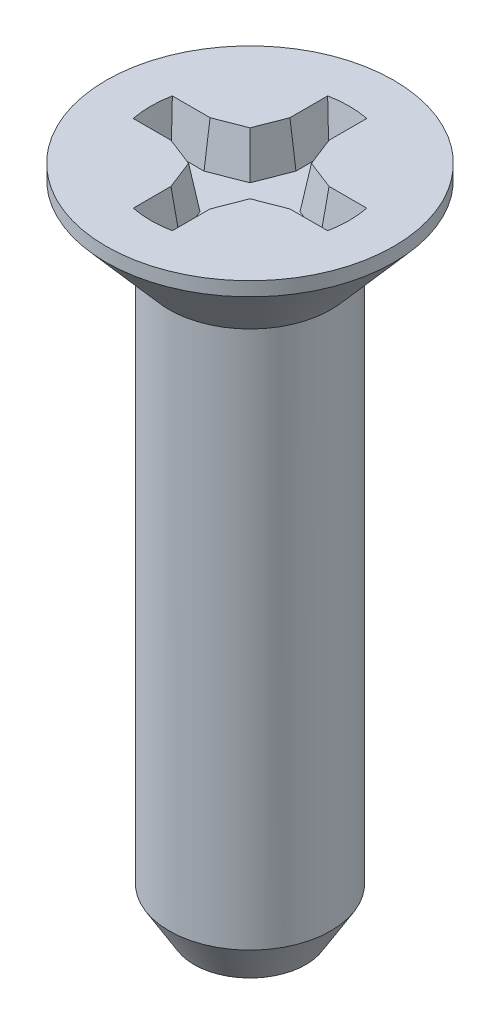
ISO-10303-21;
HEADER;
FILE_DESCRIPTION(('STEP AP214'),'2;1');
FILE_NAME('part.step','',(''),(''),'','','');
FILE_SCHEMA(('AUTOMOTIVE_DESIGN { 1 0 10303 214 1 1 1 1 }'));
ENDSEC;
DATA;
#1=APPLICATION_CONTEXT('core data for automotive mechanical design processes');
#2=APPLICATION_PROTOCOL_DEFINITION('international standard','automotive_design',2000,#1);
#3=PRODUCT_CONTEXT('',#1,'mechanical');
#4=PRODUCT('Part','Part','',(#3));
#5=PRODUCT_RELATED_PRODUCT_CATEGORY('part','',(#4));
#6=PRODUCT_DEFINITION_FORMATION('','',#4);
#7=PRODUCT_DEFINITION_CONTEXT('part definition',#1,'design');
#8=PRODUCT_DEFINITION('design','',#6,#7);
#9=PRODUCT_DEFINITION_SHAPE('','',#8);
#10=(LENGTH_UNIT() NAMED_UNIT(*) SI_UNIT(.MILLI.,.METRE.));
#11=(NAMED_UNIT(*) PLANE_ANGLE_UNIT() SI_UNIT($,.RADIAN.));
#12=(NAMED_UNIT(*) SI_UNIT($,.STERADIAN.) SOLID_ANGLE_UNIT());
#13=UNCERTAINTY_MEASURE_WITH_UNIT(LENGTH_MEASURE(1.E-05),#10,'distance_accuracy_value','');
#14=(GEOMETRIC_REPRESENTATION_CONTEXT(3) GLOBAL_UNCERTAINTY_ASSIGNED_CONTEXT((#13)) GLOBAL_UNIT_ASSIGNED_CONTEXT((#10,
#11,#12)) REPRESENTATION_CONTEXT('',''));
#15=CARTESIAN_POINT('',(0.,0.,0.));
#16=DIRECTION('',(0.,0.,1.));
#17=DIRECTION('',(1.,0.,0.));
#18=AXIS2_PLACEMENT_3D('',#15,#16,#17);
#19=CARTESIAN_POINT('',(-0.927922241607243,0.806871089453616,0.));
#20=DIRECTION('',(0.,1.,0.));
#21=DIRECTION('',(0.,0.,1.));
#22=AXIS2_PLACEMENT_3D('',#19,#20,#21);
#23=PLANE('',#22);
#24=CARTESIAN_POINT('',(0.,0.80687108948041,0.));
#25=DIRECTION('',(0.,1.,0.));
#26=DIRECTION('',(0.,0.,1.));
#27=AXIS2_PLACEMENT_3D('',#24,#25,#26);
#28=CIRCLE('',#27,1.66903884070518);
#29=CARTESIAN_POINT('',(-1.65431074080423,0.806871089467013,-0.22123884070015));
#30=VERTEX_POINT('',#29);
#31=CARTESIAN_POINT('',(-1.65431074080376,0.806871089467013,0.221238840702511));
#32=VERTEX_POINT('',#31);
#33=EDGE_CURVE('E414',#30,#32,#28,.T.);
#34=ORIENTED_EDGE('',*,*,#33,.T.);
#35=DIRECTION('',(1.,0.,0.));
#36=VECTOR('',#35,1.);
#37=CARTESIAN_POINT('',(-1.08219326921796,0.806871089453616,0.221238840700149));
#38=LINE('',#37,#36);
#39=CARTESIAN_POINT('',(-1.05702642331564,0.806871089453616,0.221238840700149));
#40=VERTEX_POINT('',#39);
#41=EDGE_CURVE('E511',#32,#40,#38,.T.);
#42=ORIENTED_EDGE('',*,*,#41,.T.);
#43=DIRECTION('',(0.932210182981526,0.,0.36191735900002));
#44=VECTOR('',#43,1.);
#45=CARTESIAN_POINT('',(-0.51017236448503,0.806871089453615,0.433547159514489));
#46=LINE('',#45,#44);
#47=CARTESIAN_POINT('',(-0.454976262069026,0.806871089453615,0.454976262069025));
#48=VERTEX_POINT('',#47);
#49=EDGE_CURVE('E251',#40,#48,#46,.T.);
#50=ORIENTED_EDGE('',*,*,#49,.T.);
#51=DIRECTION('',(0.361917359000019,0.,0.932210182981527));
#52=VECTOR('',#51,1.);
#53=CARTESIAN_POINT('',(-0.230347159103477,0.806871089453615,1.03356563329197));
#54=LINE('',#53,#52);
#55=CARTESIAN_POINT('',(-0.22123884070015,0.806871089453615,1.05702642331564));
#56=VERTEX_POINT('',#55);
#57=EDGE_CURVE('E262',#48,#56,#54,.T.);
#58=ORIENTED_EDGE('',*,*,#57,.T.);
#59=DIRECTION('',(0.,0.,1.));
#60=VECTOR('',#59,1.);
#61=CARTESIAN_POINT('',(-0.22123884070015,0.806871089453616,1.76799326921796));
#62=LINE('',#61,#60);
#63=CARTESIAN_POINT('',(-0.221238840701048,0.806871089467013,1.65431074081271));
#64=VERTEX_POINT('',#63);
#65=EDGE_CURVE('E270',#56,#64,#62,.T.);
#66=ORIENTED_EDGE('',*,*,#65,.T.);
#67=CARTESIAN_POINT('',(0.,0.80687108948041,0.));
#68=DIRECTION('',(0.,1.,0.));
#69=DIRECTION('',(-1.,0.,0.));
#70=AXIS2_PLACEMENT_3D('',#67,#68,#69);
#71=CIRCLE('',#70,1.6690388407137);
#72=CARTESIAN_POINT('',(0.221238840702511,0.806871089467013,1.65431074080806));
#73=VERTEX_POINT('',#72);
#74=EDGE_CURVE('E298',#64,#73,#71,.T.);
#75=ORIENTED_EDGE('',*,*,#74,.T.);
#76=DIRECTION('',(0.,0.,1.));
#77=VECTOR('',#76,1.);
#78=CARTESIAN_POINT('',(0.221238840700149,0.806871089453616,1.08219326921796));
#79=LINE('',#78,#77);
#80=CARTESIAN_POINT('',(0.221238840700149,0.806871089453616,1.05702642331564));
#81=VERTEX_POINT('',#80);
#82=EDGE_CURVE('E301',#73,#81,#79,.F.);
#83=ORIENTED_EDGE('',*,*,#82,.T.);
#84=DIRECTION('',(0.36191735900002,0.,-0.932210182981526));
#85=VECTOR('',#84,1.);
#86=CARTESIAN_POINT('',(0.433547159514489,0.806871089453615,0.51017236448503));
#87=LINE('',#86,#85);
#88=CARTESIAN_POINT('',(0.454976262069025,0.806871089453615,0.454976262069026));
#89=VERTEX_POINT('',#88);
#90=EDGE_CURVE('E271',#81,#89,#87,.T.);
#91=ORIENTED_EDGE('',*,*,#90,.T.);
#92=DIRECTION('',(0.932210182981527,0.,-0.361917359000019));
#93=VECTOR('',#92,1.);
#94=CARTESIAN_POINT('',(1.03356563329197,0.806871089453615,0.230347159103477));
#95=LINE('',#94,#93);
#96=CARTESIAN_POINT('',(1.05702642331564,0.806871089453615,0.22123884070015));
#97=VERTEX_POINT('',#96);
#98=EDGE_CURVE('E332',#89,#97,#95,.T.);
#99=ORIENTED_EDGE('',*,*,#98,.T.);
#100=DIRECTION('',(1.,0.,0.));
#101=VECTOR('',#100,1.);
#102=CARTESIAN_POINT('',(1.76799326921796,0.806871089453616,0.22123884070015));
#103=LINE('',#102,#101);
#104=CARTESIAN_POINT('',(1.65431074081271,0.806871089467013,0.221238840701048));
#105=VERTEX_POINT('',#104);
#106=EDGE_CURVE('E335',#97,#105,#103,.T.);
#107=ORIENTED_EDGE('',*,*,#106,.T.);
#108=CARTESIAN_POINT('',(0.,0.80687108948041,0.));
#109=DIRECTION('',(0.,1.,0.));
#110=DIRECTION('',(0.,0.,1.));
#111=AXIS2_PLACEMENT_3D('',#108,#109,#110);
#112=CIRCLE('',#111,1.6690388407137);
#113=CARTESIAN_POINT('',(1.65431074080806,0.806871089467013,-0.221238840702511));
#114=VERTEX_POINT('',#113);
#115=EDGE_CURVE('E344',#105,#114,#112,.T.);
#116=ORIENTED_EDGE('',*,*,#115,.T.);
#117=DIRECTION('',(1.,0.,0.));
#118=VECTOR('',#117,1.);
#119=CARTESIAN_POINT('',(1.08219326921796,0.806871089453616,-0.221238840700149));
#120=LINE('',#119,#118);
#121=CARTESIAN_POINT('',(1.05702642331564,0.806871089453616,-0.221238840700149));
#122=VERTEX_POINT('',#121);
#123=EDGE_CURVE('E345',#114,#122,#120,.F.);
#124=ORIENTED_EDGE('',*,*,#123,.T.);
#125=DIRECTION('',(-0.932210182981526,0.,-0.36191735900002));
#126=VECTOR('',#125,1.);
#127=CARTESIAN_POINT('',(0.51017236448503,0.806871089453615,-0.433547159514489));
#128=LINE('',#127,#126);
#129=CARTESIAN_POINT('',(0.454976262069026,0.806871089453615,-0.454976262069025));
#130=VERTEX_POINT('',#129);
#131=EDGE_CURVE('E438',#122,#130,#128,.T.);
#132=ORIENTED_EDGE('',*,*,#131,.T.);
#133=DIRECTION('',(-0.361917359000019,0.,-0.932210182981527));
#134=VECTOR('',#133,1.);
#135=CARTESIAN_POINT('',(0.230347159103477,0.806871089453615,-1.03356563329197));
#136=LINE('',#135,#134);
#137=CARTESIAN_POINT('',(0.22123884070015,0.806871089453616,-1.05702642331564));
#138=VERTEX_POINT('',#137);
#139=EDGE_CURVE('E378',#130,#138,#136,.T.);
#140=ORIENTED_EDGE('',*,*,#139,.T.);
#141=DIRECTION('',(0.,0.,1.));
#142=VECTOR('',#141,1.);
#143=CARTESIAN_POINT('',(0.22123884070015,0.806871089453618,-1.76799326921796));
#144=LINE('',#143,#142);
#145=CARTESIAN_POINT('',(0.221238840701049,0.806871089467014,-1.65431074081271));
#146=VERTEX_POINT('',#145);
#147=EDGE_CURVE('E152',#138,#146,#144,.F.);
#148=ORIENTED_EDGE('',*,*,#147,.T.);
#149=CARTESIAN_POINT('',(0.,0.80687108948041,0.));
#150=DIRECTION('',(0.,1.,0.));
#151=DIRECTION('',(-1.,0.,0.));
#152=AXIS2_PLACEMENT_3D('',#149,#150,#151);
#153=CIRCLE('',#152,1.6690388407137);
#154=CARTESIAN_POINT('',(-0.221238840702512,0.806871089467014,-1.65431074080806));
#155=VERTEX_POINT('',#154);
#156=EDGE_CURVE('E20',#146,#155,#153,.T.);
#157=ORIENTED_EDGE('',*,*,#156,.T.);
#158=DIRECTION('',(0.,0.,1.));
#159=VECTOR('',#158,1.);
#160=CARTESIAN_POINT('',(-0.22123884070015,0.806871089453618,-1.08219326921796));
#161=LINE('',#160,#159);
#162=CARTESIAN_POINT('',(-0.221238840700149,0.806871089453618,-1.05702642331564));
#163=VERTEX_POINT('',#162);
#164=EDGE_CURVE('E155',#155,#163,#161,.T.);
#165=ORIENTED_EDGE('',*,*,#164,.T.);
#166=DIRECTION('',(-0.36191735900002,0.,0.932210182981526));
#167=VECTOR('',#166,1.);
#168=CARTESIAN_POINT('',(-0.433547159514489,0.806871089453618,-0.51017236448503));
#169=LINE('',#168,#167);
#170=CARTESIAN_POINT('',(-0.454976262069026,0.806871089453616,-0.454976262069026));
#171=VERTEX_POINT('',#170);
#172=EDGE_CURVE('E167',#163,#171,#169,.T.);
#173=ORIENTED_EDGE('',*,*,#172,.T.);
#174=DIRECTION('',(-0.932210182981527,0.,0.361917359000019));
#175=VECTOR('',#174,1.);
#176=CARTESIAN_POINT('',(-1.03356563329197,0.806871089453615,-0.230347159103477));
#177=LINE('',#176,#175);
#178=CARTESIAN_POINT('',(-1.05702642331564,0.806871089453615,-0.22123884070015));
#179=VERTEX_POINT('',#178);
#180=EDGE_CURVE('E506',#171,#179,#177,.T.);
#181=ORIENTED_EDGE('',*,*,#180,.T.);
#182=DIRECTION('',(1.,0.,0.));
#183=VECTOR('',#182,1.);
#184=CARTESIAN_POINT('',(-1.76799326921796,0.806871089453616,-0.22123884070015));
#185=LINE('',#184,#183);
#186=EDGE_CURVE('E248',#179,#30,#185,.F.);
#187=ORIENTED_EDGE('',*,*,#186,.T.);
#188=EDGE_LOOP('',(#34,#42,#50,#58,#66,#75,#83,#91,#99,#107,#116,#124,#132,#140,#148,#157,#165,
#173,#181,#187));
#189=FACE_BOUND('',#188,.T.);
#190=ADVANCED_FACE('F17',(#189),#23,.T.);
#191=CARTESIAN_POINT('',(-0.558800000411013,1.56887108945362,-0.558800000411013));
#192=DIRECTION('',(-0.918047815637136,-0.173648177666931,-0.356419021092922));
#193=DIRECTION('',(-0.36191735900002,0.,0.932210182981526));
#194=AXIS2_PLACEMENT_3D('',#191,#192,#193);
#195=PLANE('',#194);
#196=DIRECTION('',(0.133790507053865,-0.981936963579913,0.133790507053865));
#197=VECTOR('',#196,1.);
#198=CARTESIAN_POINT('',(-0.558800000411013,1.56887108945362,-0.558800000411013));
#199=LINE('',#198,#197);
#200=CARTESIAN_POINT('',(-0.558800000411013,1.56887108945362,-0.558800000411013));
#201=VERTEX_POINT('',#200);
#202=EDGE_CURVE('E247',#201,#171,#199,.T.);
#203=ORIENTED_EDGE('',*,*,#202,.T.);
#204=ORIENTED_EDGE('',*,*,#172,.F.);
#205=DIRECTION('',(-0.173556398022337,0.98428724478241,-0.0325084060538774));
#206=VECTOR('',#205,1.);
#207=CARTESIAN_POINT('',(-0.22123884070015,0.806871089453618,-1.05702642331564));
#208=LINE('',#207,#206);
#209=CARTESIAN_POINT('',(-0.3556,1.56887108945362,-1.08219326921796));
#210=VERTEX_POINT('',#209);
#211=EDGE_CURVE('E161',#163,#210,#208,.T.);
#212=ORIENTED_EDGE('',*,*,#211,.T.);
#213=DIRECTION('',(0.361917359000019,0.,-0.932210182981527));
#214=VECTOR('',#213,1.);
#215=CARTESIAN_POINT('',(-0.558800000411013,1.56887108945362,-0.558800000411013));
#216=LINE('',#215,#214);
#217=EDGE_CURVE('E495',#201,#210,#216,.T.);
#218=ORIENTED_EDGE('',*,*,#217,.F.);
#219=EDGE_LOOP('',(#203,#204,#212,#218));
#220=FACE_BOUND('',#219,.T.);
#221=ADVANCED_FACE('F189',(#220),#195,.F.);
#222=CARTESIAN_POINT('',(-0.3556,1.56887108945362,-1.08219326921796));
#223=DIRECTION('',(-0.984807753012208,-0.173648177666931,0.));
#224=DIRECTION('',(0.173648177666931,-0.984807753012208,0.));
#225=AXIS2_PLACEMENT_3D('',#222,#223,#224);
#226=PLANE('',#225);
#227=ORIENTED_EDGE('',*,*,#211,.F.);
#228=ORIENTED_EDGE('',*,*,#164,.F.);
#229=CARTESIAN_POINT('',(-0.3556,1.56887108945362,-1.76799326921796));
#230=CARTESIAN_POINT('',(-0.286187807340527,1.17521498316415,-1.71115200500038));
#231=CARTESIAN_POINT('',(-0.221238840700149,0.806871089453618,-1.65431074080154));
#232=B_SPLINE_CURVE_WITH_KNOTS('',2,(#229,#230,#231),.UNSPECIFIED.,.F.,.F.,(3,3),(0.,1.),.UNSPECIFIED.);
#233=CARTESIAN_POINT('',(-0.3556,1.568871089443,-1.76799326921954));
#234=VERTEX_POINT('',#233);
#235=EDGE_CURVE('E160',#155,#234,#232,.F.);
#236=ORIENTED_EDGE('',*,*,#235,.T.);
#237=DIRECTION('',(0.,0.,1.));
#238=VECTOR('',#237,1.);
#239=CARTESIAN_POINT('',(-0.3556,1.56887108945362,-2.6162));
#240=LINE('',#239,#238);
#241=EDGE_CURVE('E413',#210,#234,#240,.F.);
#242=ORIENTED_EDGE('',*,*,#241,.F.);
#243=EDGE_LOOP('',(#227,#228,#236,#242));
#244=FACE_BOUND('',#243,.T.);
#245=ADVANCED_FACE('F164',(#244),#226,.F.);
#246=CARTESIAN_POINT('',(0.,1.56887108937553,0.));
#247=DIRECTION('',(0.,1.,0.));
#248=DIRECTION('',(-1.,0.,0.));
#249=AXIS2_PLACEMENT_3D('',#246,#247,#248);
#250=CONICAL_SURFACE('',#249,1.80339999999309,0.174532925196931);
#251=ORIENTED_EDGE('',*,*,#235,.F.);
#252=ORIENTED_EDGE('',*,*,#156,.F.);
#253=CARTESIAN_POINT('',(0.221238840701285,0.806871089452109,-1.65431074081002));
#254=CARTESIAN_POINT('',(0.226635193464304,0.83747534901604,-1.65903345305247));
#255=CARTESIAN_POINT('',(0.23203202729586,0.868082569594097,-1.66373641901501));
#256=CARTESIAN_POINT('',(0.242883224079703,0.929623469025492,-1.67315286034686));
#257=CARTESIAN_POINT('',(0.248337597317784,0.960557208221563,-1.67786592951154));
#258=CARTESIAN_POINT('',(0.259303921873243,1.02275114365864,-1.68730232041197));
#259=CARTESIAN_POINT('',(0.264815883739204,1.05401139879916,-1.69202524165424));
#260=CARTESIAN_POINT('',(0.275897411109618,1.11685836826244,-1.70148107938818));
#261=CARTESIAN_POINT('',(0.281466987181238,1.1484451401432,-1.70621360092361));
#262=CARTESIAN_POINT('',(0.292663752032317,1.21194514417946,-1.71568839470482));
#263=CARTESIAN_POINT('',(0.29829095123327,1.24385843260341,-1.72043027749923));
#264=CARTESIAN_POINT('',(0.309602953024043,1.30801147119628,-1.72992355833688));
#265=CARTESIAN_POINT('',(0.315287765712782,1.34025127640755,-1.73467457236492));
#266=CARTESIAN_POINT('',(0.326714968571573,1.40505734921649,-1.74418589341847));
#267=CARTESIAN_POINT('',(0.332457368365894,1.43762367067855,-1.74894582183983));
#268=CARTESIAN_POINT('',(0.343999698834219,1.50308277925359,-1.75847475237522));
#269=CARTESIAN_POINT('',(0.349799638471151,1.53597561913263,-1.76324338117053));
#270=CARTESIAN_POINT('',(0.355600000001311,1.56887108945244,-1.76799326922448));
#271=B_SPLINE_CURVE_WITH_KNOTS('',3,(#253,#254,#255,#256,#257,#258,#259,#260,#261,#262,#263,
#264,#265,#266,#267,#268,#269,#270),.UNSPECIFIED.,.F.,.F.,(4,2,2,2,2,2,2,2,4),(0.,
0.0942995572166541,0.189587175231727,0.285862908194574,0.383126803270743,0.481378900896991,
0.58061923502583,0.680847833360334,0.782064717579877),.UNSPECIFIED.);
#272=CARTESIAN_POINT('',(0.355600000000656,1.56887108944241,-1.7679932692228));
#273=VERTEX_POINT('',#272);
#274=EDGE_CURVE('E174',#146,#273,#271,.T.);
#275=ORIENTED_EDGE('',*,*,#274,.T.);
#276=CARTESIAN_POINT('',(0.,1.56887108943238,0.));
#277=DIRECTION('',(0.,1.,0.));
#278=DIRECTION('',(-1.,0.,0.));
#279=AXIS2_PLACEMENT_3D('',#276,#277,#278);
#280=CIRCLE('',#279,1.80340000000311);
#281=EDGE_CURVE('E171',#234,#273,#280,.F.);
#282=ORIENTED_EDGE('',*,*,#281,.F.);
#283=EDGE_LOOP('',(#251,#252,#275,#282));
#284=FACE_BOUND('',#283,.T.);
#285=ADVANCED_FACE('F169',(#284),#250,.F.);
#286=CARTESIAN_POINT('',(0.3556,1.56887108945362,-1.76799326921796));
#287=DIRECTION('',(0.984807753012208,-0.17364817766693,0.));
#288=DIRECTION('',(0.17364817766693,0.984807753012208,0.));
#289=AXIS2_PLACEMENT_3D('',#286,#287,#288);
#290=PLANE('',#289);
#291=ORIENTED_EDGE('',*,*,#274,.F.);
#292=ORIENTED_EDGE('',*,*,#147,.F.);
#293=DIRECTION('',(0.173556398022336,0.98428724478241,-0.0325084060538774));
#294=VECTOR('',#293,1.);
#295=CARTESIAN_POINT('',(0.22123884070015,0.806871089453618,-1.05702642331564));
#296=LINE('',#295,#294);
#297=CARTESIAN_POINT('',(0.3556,1.56887108945362,-1.08219326921796));
#298=VERTEX_POINT('',#297);
#299=EDGE_CURVE('E380',#138,#298,#296,.T.);
#300=ORIENTED_EDGE('',*,*,#299,.T.);
#301=DIRECTION('',(0.,0.,1.));
#302=VECTOR('',#301,1.);
#303=CARTESIAN_POINT('',(0.3556,1.56887108945362,-2.6162));
#304=LINE('',#303,#302);
#305=EDGE_CURVE('E377',#273,#298,#304,.T.);
#306=ORIENTED_EDGE('',*,*,#305,.F.);
#307=EDGE_LOOP('',(#291,#292,#300,#306));
#308=FACE_BOUND('',#307,.T.);
#309=ADVANCED_FACE('F367',(#308),#290,.F.);
#310=CARTESIAN_POINT('',(0.3556,1.56887108945362,-1.08219326921796));
#311=DIRECTION('',(0.918047815637137,-0.17364817766693,-0.356419021092922));
#312=DIRECTION('',(-0.361917359000019,0.,-0.932210182981527));
#313=AXIS2_PLACEMENT_3D('',#310,#311,#312);
#314=PLANE('',#313);
#315=ORIENTED_EDGE('',*,*,#299,.F.);
#316=ORIENTED_EDGE('',*,*,#139,.F.);
#317=DIRECTION('',(0.133790507053866,0.981936963579913,-0.133790507053867));
#318=VECTOR('',#317,1.);
#319=CARTESIAN_POINT('',(0.454976262069026,0.806871089453616,-0.454976262069025));
#320=LINE('',#319,#318);
#321=CARTESIAN_POINT('',(0.558800000411013,1.56887108945362,-0.558800000411013));
#322=VERTEX_POINT('',#321);
#323=EDGE_CURVE('E426',#130,#322,#320,.T.);
#324=ORIENTED_EDGE('',*,*,#323,.T.);
#325=DIRECTION('',(0.361917359000019,0.,0.932210182981527));
#326=VECTOR('',#325,1.);
#327=CARTESIAN_POINT('',(0.3556,1.56887108945362,-1.08219326921796));
#328=LINE('',#327,#326);
#329=EDGE_CURVE('E434',#298,#322,#328,.T.);
#330=ORIENTED_EDGE('',*,*,#329,.F.);
#331=EDGE_LOOP('',(#315,#316,#324,#330));
#332=FACE_BOUND('',#331,.T.);
#333=ADVANCED_FACE('F364',(#332),#314,.F.);
#334=CARTESIAN_POINT('',(0.558800000411013,1.56887108945362,-0.558800000411013));
#335=DIRECTION('',(0.356419021092922,-0.173648177666931,-0.918047815637136));
#336=DIRECTION('',(-0.932210182981526,0.,-0.36191735900002));
#337=AXIS2_PLACEMENT_3D('',#334,#335,#336);
#338=PLANE('',#337);
#339=ORIENTED_EDGE('',*,*,#323,.F.);
#340=ORIENTED_EDGE('',*,*,#131,.F.);
#341=DIRECTION('',(0.0325084060538773,0.98428724478241,-0.173556398022337));
#342=VECTOR('',#341,1.);
#343=CARTESIAN_POINT('',(1.05702642331564,0.806871089453616,-0.221238840700149));
#344=LINE('',#343,#342);
#345=CARTESIAN_POINT('',(1.08219326921796,1.56887108945362,-0.3556));
#346=VERTEX_POINT('',#345);
#347=EDGE_CURVE('E418',#122,#346,#344,.T.);
#348=ORIENTED_EDGE('',*,*,#347,.T.);
#349=DIRECTION('',(0.932210182981527,0.,0.361917359000019));
#350=VECTOR('',#349,1.);
#351=CARTESIAN_POINT('',(0.558800000411013,1.56887108945362,-0.558800000411013));
#352=LINE('',#351,#350);
#353=EDGE_CURVE('E431',#322,#346,#352,.T.);
#354=ORIENTED_EDGE('',*,*,#353,.F.);
#355=EDGE_LOOP('',(#339,#340,#348,#354));
#356=FACE_BOUND('',#355,.T.);
#357=ADVANCED_FACE('F358',(#356),#338,.F.);
#358=CARTESIAN_POINT('',(1.08219326921796,1.56887108945362,-0.3556));
#359=DIRECTION('',(0.,-0.173648177666931,-0.984807753012208));
#360=DIRECTION('',(0.,0.984807753012208,-0.173648177666931));
#361=AXIS2_PLACEMENT_3D('',#358,#359,#360);
#362=PLANE('',#361);
#363=ORIENTED_EDGE('',*,*,#347,.F.);
#364=ORIENTED_EDGE('',*,*,#123,.F.);
#365=CARTESIAN_POINT('',(1.76799326921796,1.56887108945362,-0.3556));
#366=CARTESIAN_POINT('',(1.71115200499919,1.17521498316569,-0.2861878073408));
#367=CARTESIAN_POINT('',(1.65431074080154,0.806871089453616,-0.221238840700149));
#368=B_SPLINE_CURVE_WITH_KNOTS('',2,(#365,#366,#367),.UNSPECIFIED.,.F.,.F.,(3,3),(0.,1.),.UNSPECIFIED.);
#369=CARTESIAN_POINT('',(1.76799326921954,1.568871089443,-0.3556));
#370=VERTEX_POINT('',#369);
#371=EDGE_CURVE('E338',#114,#370,#368,.F.);
#372=ORIENTED_EDGE('',*,*,#371,.T.);
#373=DIRECTION('',(1.,0.,0.));
#374=VECTOR('',#373,1.);
#375=CARTESIAN_POINT('',(0.,1.56887108945362,-0.3556));
#376=LINE('',#375,#374);
#377=EDGE_CURVE('E411',#346,#370,#376,.T.);
#378=ORIENTED_EDGE('',*,*,#377,.F.);
#379=EDGE_LOOP('',(#363,#364,#372,#378));
#380=FACE_BOUND('',#379,.T.);
#381=ADVANCED_FACE('F347',(#380),#362,.F.);
#382=CARTESIAN_POINT('',(0.,1.56887108937553,0.));
#383=DIRECTION('',(0.,1.,0.));
#384=DIRECTION('',(0.,0.,1.));
#385=AXIS2_PLACEMENT_3D('',#382,#383,#384);
#386=CONICAL_SURFACE('',#385,1.80339999999309,0.174532925196931);
#387=ORIENTED_EDGE('',*,*,#371,.F.);
#388=ORIENTED_EDGE('',*,*,#115,.F.);
#389=CARTESIAN_POINT('',(1.65431074081002,0.806871089452107,0.221238840701284));
#390=CARTESIAN_POINT('',(1.65903345305247,0.837475349016039,0.226635193464301));
#391=CARTESIAN_POINT('',(1.66373641901501,0.868082569594096,0.232032027295857));
#392=CARTESIAN_POINT('',(1.67315286034686,0.929623469025492,0.242883224079702));
#393=CARTESIAN_POINT('',(1.67786592951154,0.960557208221564,0.248337597317784));
#394=CARTESIAN_POINT('',(1.68730232041197,1.02275114365864,0.259303921873243));
#395=CARTESIAN_POINT('',(1.69202524165424,1.05401139879916,0.264815883739203));
#396=CARTESIAN_POINT('',(1.70148107938818,1.11685836826244,0.275897411109617));
#397=CARTESIAN_POINT('',(1.70621360092361,1.14844514014321,0.281466987181239));
#398=CARTESIAN_POINT('',(1.71568839470482,1.21194514417947,0.292663752032319));
#399=CARTESIAN_POINT('',(1.72043027749923,1.24385843260341,0.298290951233271));
#400=CARTESIAN_POINT('',(1.72992355833688,1.30801147119629,0.309602953024043));
#401=CARTESIAN_POINT('',(1.73467457236492,1.34025127640755,0.315287765712781));
#402=CARTESIAN_POINT('',(1.74418589341847,1.40505734921649,0.326714968571574));
#403=CARTESIAN_POINT('',(1.74894582183983,1.43762367067855,0.332457368365896));
#404=CARTESIAN_POINT('',(1.75847475237522,1.50308277925359,0.343999698834221));
#405=CARTESIAN_POINT('',(1.76324338117053,1.53597561913263,0.349799638471153));
#406=CARTESIAN_POINT('',(1.76799326922448,1.56887108945244,0.355600000001311));
#407=B_SPLINE_CURVE_WITH_KNOTS('',3,(#389,#390,#391,#392,#393,#394,#395,#396,#397,#398,#399,
#400,#401,#402,#403,#404,#405,#406),.UNSPECIFIED.,.F.,.F.,(4,2,2,2,2,2,2,2,4),(0.,
0.0942995572166568,0.189587175231732,0.28586290819458,0.383126803270751,0.481378900896998,
0.580619235025836,0.680847833360339,0.78206471757988),.UNSPECIFIED.);
#408=CARTESIAN_POINT('',(1.7679932692228,1.56887108944241,0.355600000000656));
#409=VERTEX_POINT('',#408);
#410=EDGE_CURVE('E337',#105,#409,#407,.T.);
#411=ORIENTED_EDGE('',*,*,#410,.T.);
#412=CARTESIAN_POINT('',(0.,1.56887108943238,0.));
#413=DIRECTION('',(0.,1.,0.));
#414=DIRECTION('',(0.,0.,1.));
#415=AXIS2_PLACEMENT_3D('',#412,#413,#414);
#416=CIRCLE('',#415,1.80340000000311);
#417=EDGE_CURVE('E408',#370,#409,#416,.F.);
#418=ORIENTED_EDGE('',*,*,#417,.F.);
#419=EDGE_LOOP('',(#387,#388,#411,#418));
#420=FACE_BOUND('',#419,.T.);
#421=ADVANCED_FACE('F357',(#420),#386,.F.);
#422=CARTESIAN_POINT('',(1.76799326921796,1.56887108945362,0.3556));
#423=DIRECTION('',(0.,-0.17364817766693,0.984807753012208));
#424=DIRECTION('',(0.,-0.984807753012208,-0.17364817766693));
#425=AXIS2_PLACEMENT_3D('',#422,#423,#424);
#426=PLANE('',#425);
#427=ORIENTED_EDGE('',*,*,#410,.F.);
#428=ORIENTED_EDGE('',*,*,#106,.F.);
#429=DIRECTION('',(0.0325084060538772,0.98428724478241,0.173556398022336));
#430=VECTOR('',#429,1.);
#431=CARTESIAN_POINT('',(1.05702642331564,0.806871089453615,0.22123884070015));
#432=LINE('',#431,#430);
#433=CARTESIAN_POINT('',(1.08219326921796,1.56887108945362,0.3556));
#434=VERTEX_POINT('',#433);
#435=EDGE_CURVE('E330',#97,#434,#432,.T.);
#436=ORIENTED_EDGE('',*,*,#435,.T.);
#437=DIRECTION('',(1.,0.,0.));
#438=VECTOR('',#437,1.);
#439=CARTESIAN_POINT('',(0.,1.56887108945362,0.3556));
#440=LINE('',#439,#438);
#441=EDGE_CURVE('E327',#409,#434,#440,.F.);
#442=ORIENTED_EDGE('',*,*,#441,.F.);
#443=EDGE_LOOP('',(#427,#428,#436,#442));
#444=FACE_BOUND('',#443,.T.);
#445=ADVANCED_FACE('F471',(#444),#426,.F.);
#446=CARTESIAN_POINT('',(1.08219326921796,1.56887108945362,0.3556));
#447=DIRECTION('',(0.356419021092922,-0.17364817766693,0.918047815637137));
#448=DIRECTION('',(0.932210182981527,0.,-0.361917359000019));
#449=AXIS2_PLACEMENT_3D('',#446,#447,#448);
#450=PLANE('',#449);
#451=ORIENTED_EDGE('',*,*,#435,.F.);
#452=ORIENTED_EDGE('',*,*,#98,.F.);
#453=DIRECTION('',(0.133790507053866,0.981936963579913,0.133790507053866));
#454=VECTOR('',#453,1.);
#455=CARTESIAN_POINT('',(0.454976262069025,0.806871089453616,0.454976262069026));
#456=LINE('',#455,#454);
#457=CARTESIAN_POINT('',(0.558800000411013,1.56887108945362,0.558800000411013));
#458=VERTEX_POINT('',#457);
#459=EDGE_CURVE('E309',#89,#458,#456,.T.);
#460=ORIENTED_EDGE('',*,*,#459,.T.);
#461=DIRECTION('',(-0.932210182981527,0.,0.361917359000019));
#462=VECTOR('',#461,1.);
#463=CARTESIAN_POINT('',(1.08219326921796,1.56887108945362,0.3556));
#464=LINE('',#463,#462);
#465=EDGE_CURVE('E319',#434,#458,#464,.T.);
#466=ORIENTED_EDGE('',*,*,#465,.F.);
#467=EDGE_LOOP('',(#451,#452,#460,#466));
#468=FACE_BOUND('',#467,.T.);
#469=ADVANCED_FACE('F474',(#468),#450,.F.);
#470=CARTESIAN_POINT('',(0.558800000411013,1.56887108945362,0.558800000411013));
#471=DIRECTION('',(0.918047815637136,-0.173648177666931,0.356419021092922));
#472=DIRECTION('',(0.36191735900002,0.,-0.932210182981526));
#473=AXIS2_PLACEMENT_3D('',#470,#471,#472);
#474=PLANE('',#473);
#475=ORIENTED_EDGE('',*,*,#459,.F.);
#476=ORIENTED_EDGE('',*,*,#90,.F.);
#477=DIRECTION('',(0.173556398022337,0.98428724478241,0.0325084060538773));
#478=VECTOR('',#477,1.);
#479=CARTESIAN_POINT('',(0.221238840700149,0.806871089453616,1.05702642331564));
#480=LINE('',#479,#478);
#481=CARTESIAN_POINT('',(0.3556,1.56887108945362,1.08219326921796));
#482=VERTEX_POINT('',#481);
#483=EDGE_CURVE('E308',#81,#482,#480,.T.);
#484=ORIENTED_EDGE('',*,*,#483,.T.);
#485=DIRECTION('',(-0.361917359000019,0.,0.932210182981526));
#486=VECTOR('',#485,1.);
#487=CARTESIAN_POINT('',(0.558800000411013,1.56887108945362,0.558800000411013));
#488=LINE('',#487,#486);
#489=EDGE_CURVE('E315',#458,#482,#488,.T.);
#490=ORIENTED_EDGE('',*,*,#489,.F.);
#491=EDGE_LOOP('',(#475,#476,#484,#490));
#492=FACE_BOUND('',#491,.T.);
#493=ADVANCED_FACE('F290',(#492),#474,.F.);
#494=CARTESIAN_POINT('',(0.3556,1.56887108945362,1.08219326921796));
#495=DIRECTION('',(0.984807753012208,-0.173648177666931,0.));
#496=DIRECTION('',(0.173648177666931,0.984807753012208,0.));
#497=AXIS2_PLACEMENT_3D('',#494,#495,#496);
#498=PLANE('',#497);
#499=ORIENTED_EDGE('',*,*,#483,.F.);
#500=ORIENTED_EDGE('',*,*,#82,.F.);
#501=CARTESIAN_POINT('',(0.3556,1.56887108945362,1.76799326921796));
#502=CARTESIAN_POINT('',(0.286187807340549,1.17521498316427,1.71115200499893));
#503=CARTESIAN_POINT('',(0.221238840700149,0.806871089453616,1.65431074080154));
#504=B_SPLINE_CURVE_WITH_KNOTS('',2,(#501,#502,#503),.UNSPECIFIED.,.F.,.F.,(3,3),(0.,1.),.UNSPECIFIED.);
#505=CARTESIAN_POINT('',(0.3556,1.568871089443,1.76799326921954));
#506=VERTEX_POINT('',#505);
#507=EDGE_CURVE('E294',#73,#506,#504,.F.);
#508=ORIENTED_EDGE('',*,*,#507,.T.);
#509=DIRECTION('',(0.,0.,1.));
#510=VECTOR('',#509,1.);
#511=CARTESIAN_POINT('',(0.3556,1.56887108945362,-2.6162));
#512=LINE('',#511,#510);
#513=EDGE_CURVE('E318',#482,#506,#512,.T.);
#514=ORIENTED_EDGE('',*,*,#513,.F.);
#515=EDGE_LOOP('',(#499,#500,#508,#514));
#516=FACE_BOUND('',#515,.T.);
#517=ADVANCED_FACE('F284',(#516),#498,.F.);
#518=CARTESIAN_POINT('',(0.,1.56887108937553,0.));
#519=DIRECTION('',(0.,1.,0.));
#520=DIRECTION('',(-1.,0.,0.));
#521=AXIS2_PLACEMENT_3D('',#518,#519,#520);
#522=CONICAL_SURFACE('',#521,1.80339999999309,0.174532925196931);
#523=ORIENTED_EDGE('',*,*,#507,.F.);
#524=ORIENTED_EDGE('',*,*,#74,.F.);
#525=CARTESIAN_POINT('',(-0.221238840701284,0.806871089452107,1.65431074081002));
#526=CARTESIAN_POINT('',(-0.2266351934643,0.837475349016039,1.65903345305247));
#527=CARTESIAN_POINT('',(-0.232032027295856,0.868082569594097,1.66373641901501));
#528=CARTESIAN_POINT('',(-0.242883224079702,0.929623469025494,1.67315286034686));
#529=CARTESIAN_POINT('',(-0.248337597317784,0.960557208221566,1.67786592951154));
#530=CARTESIAN_POINT('',(-0.259303921873244,1.02275114365865,1.68730232041197));
#531=CARTESIAN_POINT('',(-0.264815883739203,1.05401139879916,1.69202524165424));
#532=CARTESIAN_POINT('',(-0.275897411109618,1.11685836826245,1.70148107938818));
#533=CARTESIAN_POINT('',(-0.28146698718124,1.14844514014321,1.70621360092361));
#534=CARTESIAN_POINT('',(-0.29266375203232,1.21194514417947,1.71568839470482));
#535=CARTESIAN_POINT('',(-0.298290951233272,1.24385843260342,1.72043027749923));
#536=CARTESIAN_POINT('',(-0.309602953024043,1.30801147119629,1.72992355833688));
#537=CARTESIAN_POINT('',(-0.315287765712782,1.34025127640755,1.73467457236492));
#538=CARTESIAN_POINT('',(-0.326714968571574,1.40505734921649,1.74418589341847));
#539=CARTESIAN_POINT('',(-0.332457368365896,1.43762367067855,1.74894582183983));
#540=CARTESIAN_POINT('',(-0.343999698834221,1.50308277925359,1.75847475237522));
#541=CARTESIAN_POINT('',(-0.349799638471153,1.53597561913263,1.76324338117053));
#542=CARTESIAN_POINT('',(-0.355600000001311,1.56887108945244,1.76799326922448));
#543=B_SPLINE_CURVE_WITH_KNOTS('',3,(#525,#526,#527,#528,#529,#530,#531,#532,#533,#534,#535,
#536,#537,#538,#539,#540,#541,#542),.UNSPECIFIED.,.F.,.F.,(4,2,2,2,2,2,2,2,4),(0.,
0.0942995572166583,0.189587175231735,0.285862908194584,0.383126803270754,0.481378900897002,
0.580619235025839,0.680847833360341,0.78206471757988),.UNSPECIFIED.);
#544=CARTESIAN_POINT('',(-0.355600000000656,1.56887108944241,1.7679932692228));
#545=VERTEX_POINT('',#544);
#546=EDGE_CURVE('E264',#64,#545,#543,.T.);
#547=ORIENTED_EDGE('',*,*,#546,.T.);
#548=CARTESIAN_POINT('',(0.,1.56887108943238,0.));
#549=DIRECTION('',(0.,1.,0.));
#550=DIRECTION('',(-1.,0.,0.));
#551=AXIS2_PLACEMENT_3D('',#548,#549,#550);
#552=CIRCLE('',#551,1.80340000000311);
#553=EDGE_CURVE('E404',#506,#545,#552,.F.);
#554=ORIENTED_EDGE('',*,*,#553,.F.);
#555=EDGE_LOOP('',(#523,#524,#547,#554));
#556=FACE_BOUND('',#555,.T.);
#557=ADVANCED_FACE('F273',(#556),#522,.F.);
#558=CARTESIAN_POINT('',(-0.3556,1.56887108945362,1.76799326921796));
#559=DIRECTION('',(-0.984807753012208,-0.17364817766693,0.));
#560=DIRECTION('',(0.17364817766693,-0.984807753012208,0.));
#561=AXIS2_PLACEMENT_3D('',#558,#559,#560);
#562=PLANE('',#561);
#563=ORIENTED_EDGE('',*,*,#546,.F.);
#564=ORIENTED_EDGE('',*,*,#65,.F.);
#565=DIRECTION('',(-0.173556398022336,0.98428724478241,0.0325084060538772));
#566=VECTOR('',#565,1.);
#567=CARTESIAN_POINT('',(-0.22123884070015,0.806871089453615,1.05702642331564));
#568=LINE('',#567,#566);
#569=CARTESIAN_POINT('',(-0.3556,1.56887108945362,1.08219326921796));
#570=VERTEX_POINT('',#569);
#571=EDGE_CURVE('E259',#56,#570,#568,.T.);
#572=ORIENTED_EDGE('',*,*,#571,.T.);
#573=DIRECTION('',(0.,0.,1.));
#574=VECTOR('',#573,1.);
#575=CARTESIAN_POINT('',(-0.3556,1.56887108945362,-2.6162));
#576=LINE('',#575,#574);
#577=EDGE_CURVE('E407',#545,#570,#576,.F.);
#578=ORIENTED_EDGE('',*,*,#577,.F.);
#579=EDGE_LOOP('',(#563,#564,#572,#578));
#580=FACE_BOUND('',#579,.T.);
#581=ADVANCED_FACE('F283',(#580),#562,.F.);
#582=CARTESIAN_POINT('',(-0.3556,1.56887108945362,1.08219326921796));
#583=DIRECTION('',(-0.918047815637137,-0.17364817766693,0.356419021092922));
#584=DIRECTION('',(0.361917359000019,0.,0.932210182981527));
#585=AXIS2_PLACEMENT_3D('',#582,#583,#584);
#586=PLANE('',#585);
#587=ORIENTED_EDGE('',*,*,#571,.F.);
#588=ORIENTED_EDGE('',*,*,#57,.F.);
#589=DIRECTION('',(-0.133790507053866,0.981936963579913,0.133790507053866));
#590=VECTOR('',#589,1.);
#591=CARTESIAN_POINT('',(-0.454976262069026,0.806871089453616,0.454976262069025));
#592=LINE('',#591,#590);
#593=CARTESIAN_POINT('',(-0.558800000411013,1.56887108945362,0.558800000411013));
#594=VERTEX_POINT('',#593);
#595=EDGE_CURVE('E258',#48,#594,#592,.T.);
#596=ORIENTED_EDGE('',*,*,#595,.T.);
#597=DIRECTION('',(-0.361917359000019,0.,-0.932210182981526));
#598=VECTOR('',#597,1.);
#599=CARTESIAN_POINT('',(-0.3556,1.56887108945362,1.08219326921796));
#600=LINE('',#599,#598);
#601=EDGE_CURVE('E526',#570,#594,#600,.T.);
#602=ORIENTED_EDGE('',*,*,#601,.F.);
#603=EDGE_LOOP('',(#587,#588,#596,#602));
#604=FACE_BOUND('',#603,.T.);
#605=ADVANCED_FACE('F593',(#604),#586,.F.);
#606=CARTESIAN_POINT('',(-0.558800000411013,1.56887108945362,0.558800000411013));
#607=DIRECTION('',(-0.356419021092922,-0.173648177666931,0.918047815637136));
#608=DIRECTION('',(0.932210182981526,0.,0.36191735900002));
#609=AXIS2_PLACEMENT_3D('',#606,#607,#608);
#610=PLANE('',#609);
#611=ORIENTED_EDGE('',*,*,#595,.F.);
#612=ORIENTED_EDGE('',*,*,#49,.F.);
#613=DIRECTION('',(-0.0325084060538773,0.98428724478241,0.173556398022337));
#614=VECTOR('',#613,1.);
#615=CARTESIAN_POINT('',(-1.05702642331564,0.806871089453616,0.221238840700149));
#616=LINE('',#615,#614);
#617=CARTESIAN_POINT('',(-1.08219326921796,1.56887108945362,0.3556));
#618=VERTEX_POINT('',#617);
#619=EDGE_CURVE('E417',#40,#618,#616,.T.);
#620=ORIENTED_EDGE('',*,*,#619,.T.);
#621=DIRECTION('',(-0.932210182981527,0.,-0.361917359000019));
#622=VECTOR('',#621,1.);
#623=CARTESIAN_POINT('',(-0.558800000411013,1.56887108945362,0.558800000411013));
#624=LINE('',#623,#622);
#625=EDGE_CURVE('E523',#594,#618,#624,.T.);
#626=ORIENTED_EDGE('',*,*,#625,.F.);
#627=EDGE_LOOP('',(#611,#612,#620,#626));
#628=FACE_BOUND('',#627,.T.);
#629=ADVANCED_FACE('F591',(#628),#610,.F.);
#630=CARTESIAN_POINT('',(-1.08219326921796,1.56887108945362,0.3556));
#631=DIRECTION('',(0.,-0.173648177666931,0.984807753012208));
#632=DIRECTION('',(0.,-0.984807753012208,-0.173648177666931));
#633=AXIS2_PLACEMENT_3D('',#630,#631,#632);
#634=PLANE('',#633);
#635=ORIENTED_EDGE('',*,*,#619,.F.);
#636=ORIENTED_EDGE('',*,*,#41,.F.);
#637=CARTESIAN_POINT('',(-1.76799326921796,1.56887108945362,0.3556));
#638=CARTESIAN_POINT('',(-1.71115200499893,1.17521498316427,0.286187807340549));
#639=CARTESIAN_POINT('',(-1.65431074080154,0.806871089453616,0.221238840700149));
#640=B_SPLINE_CURVE_WITH_KNOTS('',2,(#637,#638,#639),.UNSPECIFIED.,.F.,.F.,(3,3),(0.,1.),.UNSPECIFIED.);
#641=CARTESIAN_POINT('',(-1.7679932692152,1.568871089443,0.3556));
#642=VERTEX_POINT('',#641);
#643=EDGE_CURVE('E416',#32,#642,#640,.F.);
#644=ORIENTED_EDGE('',*,*,#643,.T.);
#645=DIRECTION('',(1.,0.,0.));
#646=VECTOR('',#645,1.);
#647=CARTESIAN_POINT('',(0.,1.56887108945362,0.3556));
#648=LINE('',#647,#646);
#649=EDGE_CURVE('E403',#618,#642,#648,.F.);
#650=ORIENTED_EDGE('',*,*,#649,.F.);
#651=EDGE_LOOP('',(#635,#636,#644,#650));
#652=FACE_BOUND('',#651,.T.);
#653=ADVANCED_FACE('F238',(#652),#634,.F.);
#654=CARTESIAN_POINT('',(0.,1.56887108926185,0.));
#655=DIRECTION('',(0.,1.,0.));
#656=DIRECTION('',(0.,0.,1.));
#657=AXIS2_PLACEMENT_3D('',#654,#655,#656);
#658=CONICAL_SURFACE('',#657,1.80339999996452,0.174532925196931);
#659=ORIENTED_EDGE('',*,*,#643,.F.);
#660=ORIENTED_EDGE('',*,*,#33,.F.);
#661=CARTESIAN_POINT('',(-1.65431074080184,0.806871089453563,-0.22123884070019));
#662=CARTESIAN_POINT('',(-1.659033453044,0.837475349015648,-0.226635193462881));
#663=CARTESIAN_POINT('',(-1.66373641900625,0.868082569591859,-0.232032027294104));
#664=CARTESIAN_POINT('',(-1.67315286033763,0.929623469020089,-0.242883224077361));
#665=CARTESIAN_POINT('',(-1.67786592950211,0.960557208214842,-0.248337597315188));
#666=CARTESIAN_POINT('',(-1.68730232040224,1.02275114364981,-0.259303921870224));
#667=CARTESIAN_POINT('',(-1.6920252416444,1.05401139878954,-0.264815883736015));
#668=CARTESIAN_POINT('',(-1.7014810793782,1.11685836825176,-0.275897411106179));
#669=CARTESIAN_POINT('',(-1.7062136009136,1.14844514013226,-0.281466987177721));
#670=CARTESIAN_POINT('',(-1.71568839469484,1.21194514416852,-0.292663752028735));
#671=CARTESIAN_POINT('',(-1.72043027748929,1.24385843259273,-0.298290951229701));
#672=CARTESIAN_POINT('',(-1.72992355832712,1.30801147118667,-0.309602953020595));
#673=CARTESIAN_POINT('',(-1.73467457235528,1.34025127639872,-0.315287765709443));
#674=CARTESIAN_POINT('',(-1.74418589340916,1.40505734920977,-0.326714968568557));
#675=CARTESIAN_POINT('',(-1.74894582183072,1.43762367067315,-0.332457368363092));
#676=CARTESIAN_POINT('',(-1.75847475236659,1.50308277925135,-0.343999698831949));
#677=CARTESIAN_POINT('',(-1.76324338116217,1.53597561913224,-0.349799638469199));
#678=CARTESIAN_POINT('',(-1.76799326921638,1.5688710894539,-0.355599999999682));
#679=B_SPLINE_CURVE_WITH_KNOTS('',3,(#661,#662,#663,#664,#665,#666,#667,#668,#669,#670,#671,
#672,#673,#674,#675,#676,#677,#678),.UNSPECIFIED.,.F.,.F.,(4,2,2,2,2,2,2,2,4),(0.,
0.0942995572109641,0.189587175221968,0.285862908182368,0.383126803257713,0.481378900884761,
0.580619235016024,0.68084783335458,0.7820647175798),.UNSPECIFIED.);
#680=CARTESIAN_POINT('',(-1.76799326921441,1.56887108944314,-0.355599999999841));
#681=VERTEX_POINT('',#680);
#682=EDGE_CURVE('E243',#30,#681,#679,.T.);
#683=ORIENTED_EDGE('',*,*,#682,.T.);
#684=CARTESIAN_POINT('',(0.,1.56887108943238,0.));
#685=DIRECTION('',(0.,1.,0.));
#686=DIRECTION('',(0.,0.,1.));
#687=AXIS2_PLACEMENT_3D('',#684,#685,#686);
#688=CIRCLE('',#687,1.80339999999459);
#689=EDGE_CURVE('E399',#642,#681,#688,.F.);
#690=ORIENTED_EDGE('',*,*,#689,.F.);
#691=EDGE_LOOP('',(#659,#660,#683,#690));
#692=FACE_BOUND('',#691,.T.);
#693=ADVANCED_FACE('F234',(#692),#658,.F.);
#694=CARTESIAN_POINT('',(-1.76799326921796,1.56887108945362,-0.3556));
#695=DIRECTION('',(0.,-0.17364817766693,-0.984807753012208));
#696=DIRECTION('',(0.,0.984807753012208,-0.17364817766693));
#697=AXIS2_PLACEMENT_3D('',#694,#695,#696);
#698=PLANE('',#697);
#699=ORIENTED_EDGE('',*,*,#682,.F.);
#700=ORIENTED_EDGE('',*,*,#186,.F.);
#701=DIRECTION('',(-0.0325084060538772,0.98428724478241,-0.173556398022336));
#702=VECTOR('',#701,1.);
#703=CARTESIAN_POINT('',(-1.05702642331564,0.806871089453615,-0.22123884070015));
#704=LINE('',#703,#702);
#705=CARTESIAN_POINT('',(-1.08219326921796,1.56887108945362,-0.3556));
#706=VERTEX_POINT('',#705);
#707=EDGE_CURVE('E35',#179,#706,#704,.T.);
#708=ORIENTED_EDGE('',*,*,#707,.T.);
#709=DIRECTION('',(1.,0.,0.));
#710=VECTOR('',#709,1.);
#711=CARTESIAN_POINT('',(0.,1.56887108945362,-0.3556));
#712=LINE('',#711,#710);
#713=EDGE_CURVE('E402',#681,#706,#712,.T.);
#714=ORIENTED_EDGE('',*,*,#713,.F.);
#715=EDGE_LOOP('',(#699,#700,#708,#714));
#716=FACE_BOUND('',#715,.T.);
#717=ADVANCED_FACE('F230',(#716),#698,.F.);
#718=CARTESIAN_POINT('',(-1.08219326921796,1.56887108945362,-0.3556));
#719=DIRECTION('',(-0.356419021092922,-0.17364817766693,-0.918047815637137));
#720=DIRECTION('',(-0.932210182981527,0.,0.361917359000019));
#721=AXIS2_PLACEMENT_3D('',#718,#719,#720);
#722=PLANE('',#721);
#723=ORIENTED_EDGE('',*,*,#707,.F.);
#724=ORIENTED_EDGE('',*,*,#180,.F.);
#725=ORIENTED_EDGE('',*,*,#202,.F.);
#726=DIRECTION('',(0.932210182981527,0.,-0.361917359000019));
#727=VECTOR('',#726,1.);
#728=CARTESIAN_POINT('',(-1.08219326921796,1.56887108945362,-0.3556));
#729=LINE('',#728,#727);
#730=EDGE_CURVE('E398',#706,#201,#729,.T.);
#731=ORIENTED_EDGE('',*,*,#730,.F.);
#732=EDGE_LOOP('',(#723,#724,#725,#731));
#733=FACE_BOUND('',#732,.T.);
#734=ADVANCED_FACE('F226',(#733),#722,.F.);
#735=CARTESIAN_POINT('',(0.,1.56887108945362,-2.6162));
#736=DIRECTION('',(0.,1.,0.));
#737=DIRECTION('',(0.,0.,1.));
#738=AXIS2_PLACEMENT_3D('',#735,#736,#737);
#739=PLANE('',#738);
#740=ORIENTED_EDGE('',*,*,#713,.T.);
#741=ORIENTED_EDGE('',*,*,#730,.T.);
#742=ORIENTED_EDGE('',*,*,#217,.T.);
#743=ORIENTED_EDGE('',*,*,#241,.T.);
#744=ORIENTED_EDGE('',*,*,#281,.T.);
#745=ORIENTED_EDGE('',*,*,#305,.T.);
#746=ORIENTED_EDGE('',*,*,#329,.T.);
#747=ORIENTED_EDGE('',*,*,#353,.T.);
#748=ORIENTED_EDGE('',*,*,#377,.T.);
#749=ORIENTED_EDGE('',*,*,#417,.T.);
#750=ORIENTED_EDGE('',*,*,#441,.T.);
#751=ORIENTED_EDGE('',*,*,#465,.T.);
#752=ORIENTED_EDGE('',*,*,#489,.T.);
#753=ORIENTED_EDGE('',*,*,#513,.T.);
#754=ORIENTED_EDGE('',*,*,#553,.T.);
#755=ORIENTED_EDGE('',*,*,#577,.T.);
#756=ORIENTED_EDGE('',*,*,#601,.T.);
#757=ORIENTED_EDGE('',*,*,#625,.T.);
#758=ORIENTED_EDGE('',*,*,#649,.T.);
#759=ORIENTED_EDGE('',*,*,#689,.T.);
#760=EDGE_LOOP('',(#740,#741,#742,#743,#744,#745,#746,#747,#748,#749,#750,#751,#752,#753,#754,
#755,#756,#757,#758,#759));
#761=FACE_BOUND('',#760,.T.);
#762=CARTESIAN_POINT('',(0.,1.56887108945362,0.));
#763=DIRECTION('',(0.,-1.,0.));
#764=DIRECTION('',(0.,0.,-1.));
#765=AXIS2_PLACEMENT_3D('',#762,#763,#764);
#766=CIRCLE('',#765,2.6162);
#767=CARTESIAN_POINT('',(0.,1.56887108945362,-2.6162));
#768=VERTEX_POINT('',#767);
#769=EDGE_CURVE('E395',#768,#768,#766,.T.);
#770=ORIENTED_EDGE('',*,*,#769,.F.);
#771=EDGE_LOOP('',(#770));
#772=FACE_BOUND('',#771,.T.);
#773=ADVANCED_FACE('F222',(#761,#772),#739,.T.);
#774=CARTESIAN_POINT('',(0.,1.44187108945362,0.));
#775=DIRECTION('',(0.,-1.,0.));
#776=DIRECTION('',(0.,0.,-1.));
#777=AXIS2_PLACEMENT_3D('',#774,#775,#776);
#778=CYLINDRICAL_SURFACE('',#777,2.6162);
#779=CARTESIAN_POINT('',(0.,1.31487108950523,0.));
#780=DIRECTION('',(0.,1.,0.));
#781=DIRECTION('',(0.,0.,-1.));
#782=AXIS2_PLACEMENT_3D('',#779,#780,#781);
#783=CIRCLE('',#782,2.6161999999772);
#784=CARTESIAN_POINT('',(0.,1.31487108950523,-2.6161999999772));
#785=VERTEX_POINT('',#784);
#786=EDGE_CURVE('E394',#785,#785,#783,.F.);
#787=ORIENTED_EDGE('',*,*,#786,.F.);
#788=EDGE_LOOP('',(#787));
#789=FACE_BOUND('',#788,.T.);
#790=ORIENTED_EDGE('',*,*,#769,.T.);
#791=EDGE_LOOP('',(#790));
#792=FACE_BOUND('',#791,.T.);
#793=ADVANCED_FACE('F218',(#789,#792),#778,.T.);
#794=CARTESIAN_POINT('',(0.,-10.5469289105464,0.));
#795=DIRECTION('',(0.,-1.,0.));
#796=DIRECTION('',(0.,0.,-1.));
#797=AXIS2_PLACEMENT_3D('',#794,#795,#796);
#798=PLANE('',#797);
#799=CARTESIAN_POINT('',(0.,-10.5469289105713,0.));
#800=DIRECTION('',(0.,1.,0.));
#801=DIRECTION('',(0.,0.,1.));
#802=AXIS2_PLACEMENT_3D('',#799,#800,#801);
#803=CIRCLE('',#802,1.01599999997006);
#804=CARTESIAN_POINT('',(0.,-10.5469289105713,1.01599999997005));
#805=VERTEX_POINT('',#804);
#806=EDGE_CURVE('E386',#805,#805,#803,.T.);
#807=ORIENTED_EDGE('',*,*,#806,.F.);
#808=EDGE_LOOP('',(#807));
#809=FACE_BOUND('',#808,.T.);
#810=ADVANCED_FACE('F214',(#809),#798,.T.);
#811=CARTESIAN_POINT('',(0.,1.31487108939154,0.));
#812=DIRECTION('',(0.,1.,0.));
#813=DIRECTION('',(0.,0.,1.));
#814=AXIS2_PLACEMENT_3D('',#811,#812,#813);
#815=CONICAL_SURFACE('',#814,2.61619999992035,0.715584993349993);
#816=CARTESIAN_POINT('',(0.,0.,0.));
#817=DIRECTION('',(0.,-1.,0.));
#818=DIRECTION('',(0.,0.,-1.));
#819=AXIS2_PLACEMENT_3D('',#816,#817,#818);
#820=CIRCLE('',#819,1.4732);
#821=CARTESIAN_POINT('',(0.,0.,-1.4732));
#822=VERTEX_POINT('',#821);
#823=EDGE_CURVE('E26',#822,#822,#820,.T.);
#824=ORIENTED_EDGE('',*,*,#823,.F.);
#825=EDGE_LOOP('',(#824));
#826=FACE_BOUND('',#825,.T.);
#827=ORIENTED_EDGE('',*,*,#786,.T.);
#828=EDGE_LOOP('',(#827));
#829=FACE_BOUND('',#828,.T.);
#830=ADVANCED_FACE('F207',(#826,#829),#815,.T.);
#831=CARTESIAN_POINT('',(0.,-9.78492891056248,0.));
#832=DIRECTION('',(0.,1.,0.));
#833=DIRECTION('',(0.,0.,1.));
#834=AXIS2_PLACEMENT_3D('',#831,#832,#833);
#835=CONICAL_SURFACE('',#834,1.47320000002082,0.540419500314466);
#836=ORIENTED_EDGE('',*,*,#806,.T.);
#837=EDGE_LOOP('',(#836));
#838=FACE_BOUND('',#837,.T.);
#839=CARTESIAN_POINT('',(0.,-9.78492891054637,0.));
#840=DIRECTION('',(0.,-1.,0.));
#841=DIRECTION('',(0.,0.,-1.));
#842=AXIS2_PLACEMENT_3D('',#839,#840,#841);
#843=CIRCLE('',#842,1.4732);
#844=CARTESIAN_POINT('',(0.,-9.78492891054637,-1.47320000000001));
#845=VERTEX_POINT('',#844);
#846=EDGE_CURVE('E11',#845,#845,#843,.F.);
#847=ORIENTED_EDGE('',*,*,#846,.F.);
#848=EDGE_LOOP('',(#847));
#849=FACE_BOUND('',#848,.T.);
#850=ADVANCED_FACE('F201',(#838,#849),#835,.T.);
#851=CARTESIAN_POINT('',(0.,-4.89246445527319,0.));
#852=DIRECTION('',(0.,-1.,0.));
#853=DIRECTION('',(0.,0.,-1.));
#854=AXIS2_PLACEMENT_3D('',#851,#852,#853);
#855=CYLINDRICAL_SURFACE('',#854,1.4732);
#856=ORIENTED_EDGE('',*,*,#846,.T.);
#857=EDGE_LOOP('',(#856));
#858=FACE_BOUND('',#857,.T.);
#859=ORIENTED_EDGE('',*,*,#823,.T.);
#860=EDGE_LOOP('',(#859));
#861=FACE_BOUND('',#860,.T.);
#862=ADVANCED_FACE('F199',(#858,#861),#855,.T.);
#863=CLOSED_SHELL('',(#190,#221,#245,#285,#309,#333,#357,#381,#421,#445,#469,#493,#517,#557,
#581,#605,#629,#653,#693,#717,#734,#773,#793,#810,#830,#850,#862));
#864=MANIFOLD_SOLID_BREP('B1',#863);
#865=ADVANCED_BREP_SHAPE_REPRESENTATION('',(#18,#864),#14);
#866=SHAPE_DEFINITION_REPRESENTATION(#9,#865);
ENDSEC;
END-ISO-10303-21;
